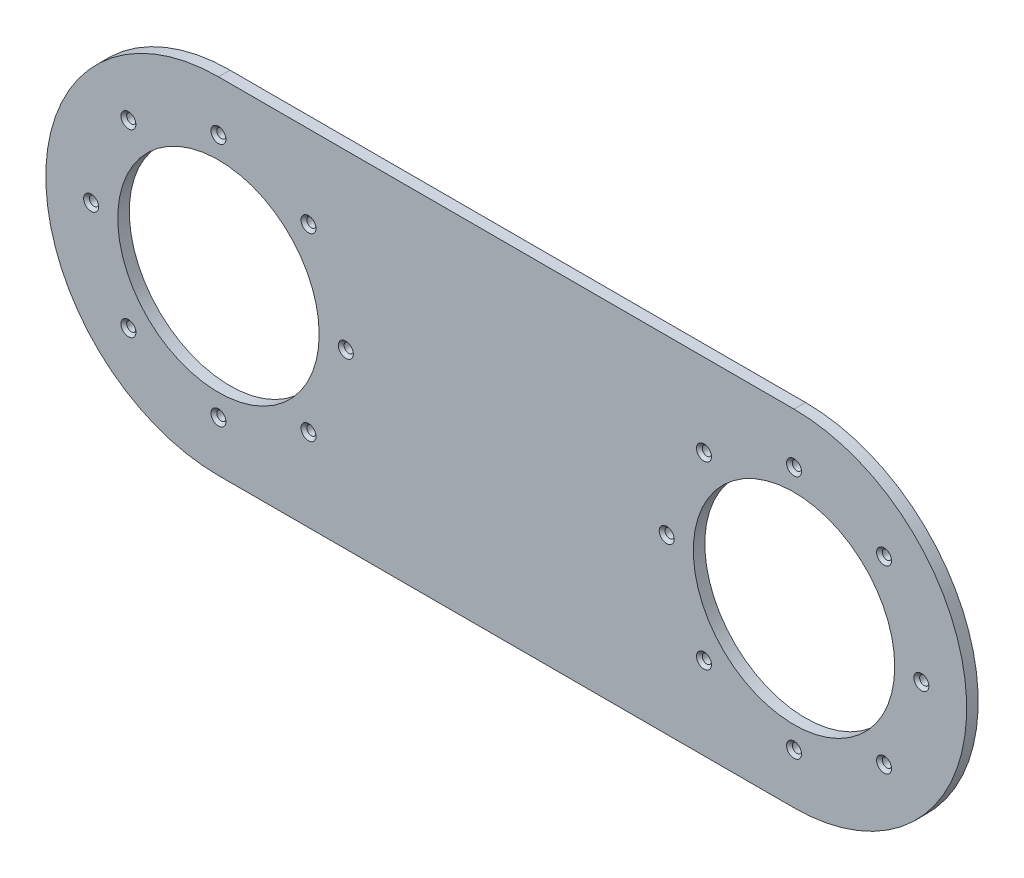
ISO-10303-21;
HEADER;
FILE_DESCRIPTION(('STEP AP214'),'2;1');
FILE_NAME('part.step','',(''),(''),'','','');
FILE_SCHEMA(('AUTOMOTIVE_DESIGN { 1 0 10303 214 1 1 1 1 }'));
ENDSEC;
DATA;
#1=APPLICATION_CONTEXT('core data for automotive mechanical design processes');
#2=APPLICATION_PROTOCOL_DEFINITION('international standard','automotive_design',2000,#1);
#3=PRODUCT_CONTEXT('',#1,'mechanical');
#4=PRODUCT('Part','Part','',(#3));
#5=PRODUCT_RELATED_PRODUCT_CATEGORY('part','',(#4));
#6=PRODUCT_DEFINITION_FORMATION('','',#4);
#7=PRODUCT_DEFINITION_CONTEXT('part definition',#1,'design');
#8=PRODUCT_DEFINITION('design','',#6,#7);
#9=PRODUCT_DEFINITION_SHAPE('','',#8);
#10=(LENGTH_UNIT() NAMED_UNIT(*) SI_UNIT(.MILLI.,.METRE.));
#11=(NAMED_UNIT(*) PLANE_ANGLE_UNIT() SI_UNIT($,.RADIAN.));
#12=(NAMED_UNIT(*) SI_UNIT($,.STERADIAN.) SOLID_ANGLE_UNIT());
#13=UNCERTAINTY_MEASURE_WITH_UNIT(LENGTH_MEASURE(1.E-05),#10,'distance_accuracy_value','');
#14=(GEOMETRIC_REPRESENTATION_CONTEXT(3) GLOBAL_UNCERTAINTY_ASSIGNED_CONTEXT((#13)) GLOBAL_UNIT_ASSIGNED_CONTEXT((#10,
#11,#12)) REPRESENTATION_CONTEXT('',''));
#15=CARTESIAN_POINT('',(0.,0.,0.));
#16=DIRECTION('',(0.,0.,1.));
#17=DIRECTION('',(1.,0.,0.));
#18=AXIS2_PLACEMENT_3D('',#15,#16,#17);
#19=CARTESIAN_POINT('',(0.,0.,4.));
#20=DIRECTION('',(0.,0.,1.));
#21=DIRECTION('',(1.,0.,0.));
#22=AXIS2_PLACEMENT_3D('',#19,#20,#21);
#23=PLANE('',#22);
#24=CARTESIAN_POINT('',(244.25,0.,4.));
#25=DIRECTION('',(0.,0.,1.));
#26=DIRECTION('',(1.,0.,0.));
#27=AXIS2_PLACEMENT_3D('',#24,#25,#26);
#28=CIRCLE('',#27,2.59999999999994);
#29=CARTESIAN_POINT('',(246.85,0.,4.));
#30=VERTEX_POINT('',#29);
#31=EDGE_CURVE('E261',#30,#30,#28,.F.);
#32=ORIENTED_EDGE('',*,*,#31,.T.);
#33=EDGE_LOOP('',(#32));
#34=FACE_BOUND('',#33,.T.);
#35=CARTESIAN_POINT('',(231.289475067505,31.2894750675047,4.));
#36=DIRECTION('',(0.,0.,1.));
#37=DIRECTION('',(1.,0.,0.));
#38=AXIS2_PLACEMENT_3D('',#35,#36,#37);
#39=CIRCLE('',#38,2.60000000000002);
#40=CARTESIAN_POINT('',(233.889475067505,31.2894750675047,4.));
#41=VERTEX_POINT('',#40);
#42=EDGE_CURVE('E257',#41,#41,#39,.F.);
#43=ORIENTED_EDGE('',*,*,#42,.T.);
#44=EDGE_LOOP('',(#43));
#45=FACE_BOUND('',#44,.T.);
#46=CARTESIAN_POINT('',(200.,42.5,4.));
#47=DIRECTION('',(0.,0.,1.));
#48=DIRECTION('',(1.,0.,0.));
#49=AXIS2_PLACEMENT_3D('',#46,#47,#48);
#50=CIRCLE('',#49,2.60000000000002);
#51=CARTESIAN_POINT('',(202.6,42.5,4.));
#52=VERTEX_POINT('',#51);
#53=EDGE_CURVE('E253',#52,#52,#50,.F.);
#54=ORIENTED_EDGE('',*,*,#53,.T.);
#55=EDGE_LOOP('',(#54));
#56=FACE_BOUND('',#55,.T.);
#57=CARTESIAN_POINT('',(231.289475067505,-31.2894750675047,4.));
#58=DIRECTION('',(0.,0.,1.));
#59=DIRECTION('',(1.,0.,0.));
#60=AXIS2_PLACEMENT_3D('',#57,#58,#59);
#61=CIRCLE('',#60,2.60000000000002);
#62=CARTESIAN_POINT('',(233.889475067505,-31.2894750675047,4.));
#63=VERTEX_POINT('',#62);
#64=EDGE_CURVE('E249',#63,#63,#61,.F.);
#65=ORIENTED_EDGE('',*,*,#64,.T.);
#66=EDGE_LOOP('',(#65));
#67=FACE_BOUND('',#66,.T.);
#68=CARTESIAN_POINT('',(200.,-42.5,4.));
#69=DIRECTION('',(0.,0.,1.));
#70=DIRECTION('',(1.,0.,0.));
#71=AXIS2_PLACEMENT_3D('',#68,#69,#70);
#72=CIRCLE('',#71,2.60000000000002);
#73=CARTESIAN_POINT('',(202.6,-42.5,4.));
#74=VERTEX_POINT('',#73);
#75=EDGE_CURVE('E245',#74,#74,#72,.F.);
#76=ORIENTED_EDGE('',*,*,#75,.T.);
#77=EDGE_LOOP('',(#76));
#78=FACE_BOUND('',#77,.T.);
#79=CARTESIAN_POINT('',(168.710524932495,31.2894750675047,4.));
#80=DIRECTION('',(0.,0.,1.));
#81=DIRECTION('',(1.,0.,0.));
#82=AXIS2_PLACEMENT_3D('',#79,#80,#81);
#83=CIRCLE('',#82,2.60000000000002);
#84=CARTESIAN_POINT('',(171.310524932495,31.2894750675047,4.));
#85=VERTEX_POINT('',#84);
#86=EDGE_CURVE('E241',#85,#85,#83,.F.);
#87=ORIENTED_EDGE('',*,*,#86,.T.);
#88=EDGE_LOOP('',(#87));
#89=FACE_BOUND('',#88,.T.);
#90=CARTESIAN_POINT('',(168.710524932495,-31.2894750675047,4.));
#91=DIRECTION('',(0.,0.,1.));
#92=DIRECTION('',(1.,0.,0.));
#93=AXIS2_PLACEMENT_3D('',#90,#91,#92);
#94=CIRCLE('',#93,2.60000000000002);
#95=CARTESIAN_POINT('',(171.310524932495,-31.2894750675047,4.));
#96=VERTEX_POINT('',#95);
#97=EDGE_CURVE('E237',#96,#96,#94,.F.);
#98=ORIENTED_EDGE('',*,*,#97,.T.);
#99=EDGE_LOOP('',(#98));
#100=FACE_BOUND('',#99,.T.);
#101=CARTESIAN_POINT('',(155.75,0.,4.));
#102=DIRECTION('',(0.,0.,1.));
#103=DIRECTION('',(1.,0.,0.));
#104=AXIS2_PLACEMENT_3D('',#101,#102,#103);
#105=CIRCLE('',#104,2.60000000000002);
#106=CARTESIAN_POINT('',(158.35,0.,4.));
#107=VERTEX_POINT('',#106);
#108=EDGE_CURVE('E233',#107,#107,#105,.F.);
#109=ORIENTED_EDGE('',*,*,#108,.T.);
#110=EDGE_LOOP('',(#109));
#111=FACE_BOUND('',#110,.T.);
#112=CARTESIAN_POINT('',(31.2894750675047,31.2894750675047,4.));
#113=DIRECTION('',(0.,0.,1.));
#114=DIRECTION('',(1.,0.,0.));
#115=AXIS2_PLACEMENT_3D('',#112,#113,#114);
#116=CIRCLE('',#115,2.60000000000005);
#117=CARTESIAN_POINT('',(33.8894750675048,31.2894750675047,4.));
#118=VERTEX_POINT('',#117);
#119=EDGE_CURVE('E229',#118,#118,#116,.F.);
#120=ORIENTED_EDGE('',*,*,#119,.T.);
#121=EDGE_LOOP('',(#120));
#122=FACE_BOUND('',#121,.T.);
#123=CARTESIAN_POINT('',(44.25,0.,4.));
#124=DIRECTION('',(0.,0.,1.));
#125=DIRECTION('',(1.,0.,0.));
#126=AXIS2_PLACEMENT_3D('',#123,#124,#125);
#127=CIRCLE('',#126,2.59999999999996);
#128=CARTESIAN_POINT('',(46.85,0.,4.));
#129=VERTEX_POINT('',#128);
#130=EDGE_CURVE('E225',#129,#129,#127,.F.);
#131=ORIENTED_EDGE('',*,*,#130,.T.);
#132=EDGE_LOOP('',(#131));
#133=FACE_BOUND('',#132,.T.);
#134=CARTESIAN_POINT('',(31.2894750675047,-31.2894750675047,4.));
#135=DIRECTION('',(0.,0.,1.));
#136=DIRECTION('',(1.,0.,0.));
#137=AXIS2_PLACEMENT_3D('',#134,#135,#136);
#138=CIRCLE('',#137,2.60000000000005);
#139=CARTESIAN_POINT('',(33.8894750675048,-31.2894750675047,4.));
#140=VERTEX_POINT('',#139);
#141=EDGE_CURVE('E221',#140,#140,#138,.F.);
#142=ORIENTED_EDGE('',*,*,#141,.T.);
#143=EDGE_LOOP('',(#142));
#144=FACE_BOUND('',#143,.T.);
#145=CARTESIAN_POINT('',(0.,-42.5,4.));
#146=DIRECTION('',(0.,0.,1.));
#147=DIRECTION('',(1.,0.,0.));
#148=AXIS2_PLACEMENT_3D('',#145,#146,#147);
#149=CIRCLE('',#148,2.60000000000005);
#150=CARTESIAN_POINT('',(2.60000000000005,-42.5,4.));
#151=VERTEX_POINT('',#150);
#152=EDGE_CURVE('E217',#151,#151,#149,.F.);
#153=ORIENTED_EDGE('',*,*,#152,.T.);
#154=EDGE_LOOP('',(#153));
#155=FACE_BOUND('',#154,.T.);
#156=CARTESIAN_POINT('',(-31.2894750675047,-31.2894750675047,4.));
#157=DIRECTION('',(0.,0.,1.));
#158=DIRECTION('',(1.,0.,0.));
#159=AXIS2_PLACEMENT_3D('',#156,#157,#158);
#160=CIRCLE('',#159,2.60000000000005);
#161=CARTESIAN_POINT('',(-28.6894750675047,-31.2894750675047,4.));
#162=VERTEX_POINT('',#161);
#163=EDGE_CURVE('E213',#162,#162,#160,.F.);
#164=ORIENTED_EDGE('',*,*,#163,.T.);
#165=EDGE_LOOP('',(#164));
#166=FACE_BOUND('',#165,.T.);
#167=CARTESIAN_POINT('',(0.,42.5,4.));
#168=DIRECTION('',(0.,0.,1.));
#169=DIRECTION('',(1.,0.,0.));
#170=AXIS2_PLACEMENT_3D('',#167,#168,#169);
#171=CIRCLE('',#170,2.60000000000005);
#172=CARTESIAN_POINT('',(2.60000000000005,42.5,4.));
#173=VERTEX_POINT('',#172);
#174=EDGE_CURVE('E209',#173,#173,#171,.F.);
#175=ORIENTED_EDGE('',*,*,#174,.T.);
#176=EDGE_LOOP('',(#175));
#177=FACE_BOUND('',#176,.T.);
#178=CARTESIAN_POINT('',(-44.25,0.,4.));
#179=DIRECTION('',(0.,0.,1.));
#180=DIRECTION('',(1.,0.,0.));
#181=AXIS2_PLACEMENT_3D('',#178,#179,#180);
#182=CIRCLE('',#181,2.59999999999996);
#183=CARTESIAN_POINT('',(-41.65,0.,4.));
#184=VERTEX_POINT('',#183);
#185=EDGE_CURVE('E205',#184,#184,#182,.F.);
#186=ORIENTED_EDGE('',*,*,#185,.T.);
#187=EDGE_LOOP('',(#186));
#188=FACE_BOUND('',#187,.T.);
#189=CARTESIAN_POINT('',(-31.2894750675047,31.2894750675047,4.));
#190=DIRECTION('',(0.,0.,1.));
#191=DIRECTION('',(1.,0.,0.));
#192=AXIS2_PLACEMENT_3D('',#189,#190,#191);
#193=CIRCLE('',#192,2.60000000000005);
#194=CARTESIAN_POINT('',(-28.6894750675047,31.2894750675047,4.));
#195=VERTEX_POINT('',#194);
#196=EDGE_CURVE('E136',#195,#195,#193,.F.);
#197=ORIENTED_EDGE('',*,*,#196,.T.);
#198=EDGE_LOOP('',(#197));
#199=FACE_BOUND('',#198,.T.);
#200=CARTESIAN_POINT('',(0.,0.,4.));
#201=DIRECTION('',(0.,0.,1.));
#202=DIRECTION('',(1.,0.,0.));
#203=AXIS2_PLACEMENT_3D('',#200,#201,#202);
#204=CIRCLE('',#203,35.);
#205=CARTESIAN_POINT('',(35.,0.,4.));
#206=VERTEX_POINT('',#205);
#207=EDGE_CURVE('E123',#206,#206,#204,.T.);
#208=ORIENTED_EDGE('',*,*,#207,.F.);
#209=EDGE_LOOP('',(#208));
#210=FACE_BOUND('',#209,.T.);
#211=CARTESIAN_POINT('',(0.,0.,4.));
#212=DIRECTION('',(0.,0.,1.));
#213=DIRECTION('',(1.,0.,0.));
#214=AXIS2_PLACEMENT_3D('',#211,#212,#213);
#215=CIRCLE('',#214,60.);
#216=CARTESIAN_POINT('',(0.,60.,4.));
#217=VERTEX_POINT('',#216);
#218=CARTESIAN_POINT('',(0.,-60.,4.));
#219=VERTEX_POINT('',#218);
#220=EDGE_CURVE('E100',#217,#219,#215,.T.);
#221=ORIENTED_EDGE('',*,*,#220,.T.);
#222=DIRECTION('',(1.,0.,0.));
#223=VECTOR('',#222,1.);
#224=CARTESIAN_POINT('',(0.,-60.,4.));
#225=LINE('',#224,#223);
#226=CARTESIAN_POINT('',(200.,-60.,4.));
#227=VERTEX_POINT('',#226);
#228=EDGE_CURVE('E95',#219,#227,#225,.T.);
#229=ORIENTED_EDGE('',*,*,#228,.T.);
#230=CARTESIAN_POINT('',(200.,0.,4.));
#231=DIRECTION('',(0.,0.,1.));
#232=DIRECTION('',(1.,0.,0.));
#233=AXIS2_PLACEMENT_3D('',#230,#231,#232);
#234=CIRCLE('',#233,60.);
#235=CARTESIAN_POINT('',(200.,60.,4.));
#236=VERTEX_POINT('',#235);
#237=EDGE_CURVE('E98',#227,#236,#234,.T.);
#238=ORIENTED_EDGE('',*,*,#237,.T.);
#239=DIRECTION('',(-1.,0.,0.));
#240=VECTOR('',#239,1.);
#241=CARTESIAN_POINT('',(0.,60.,4.));
#242=LINE('',#241,#240);
#243=EDGE_CURVE('E64',#236,#217,#242,.T.);
#244=ORIENTED_EDGE('',*,*,#243,.T.);
#245=EDGE_LOOP('',(#221,#229,#238,#244));
#246=FACE_BOUND('',#245,.T.);
#247=CARTESIAN_POINT('',(200.,0.,4.));
#248=DIRECTION('',(0.,0.,1.));
#249=DIRECTION('',(1.,0.,0.));
#250=AXIS2_PLACEMENT_3D('',#247,#248,#249);
#251=CIRCLE('',#250,35.);
#252=CARTESIAN_POINT('',(235.,0.,4.));
#253=VERTEX_POINT('',#252);
#254=EDGE_CURVE('E552',#253,#253,#251,.T.);
#255=ORIENTED_EDGE('',*,*,#254,.F.);
#256=EDGE_LOOP('',(#255));
#257=FACE_BOUND('',#256,.T.);
#258=ADVANCED_FACE('F45',(#34,#45,#56,#67,#78,#89,#100,#111,#122,#133,#144,#155,#166,#177,#188,
#199,#210,#246,#257),#23,.T.);
#259=CARTESIAN_POINT('',(0.,0.,0.));
#260=DIRECTION('',(0.,0.,1.));
#261=DIRECTION('',(1.,0.,0.));
#262=AXIS2_PLACEMENT_3D('',#259,#260,#261);
#263=PLANE('',#262);
#264=CARTESIAN_POINT('',(-44.25,0.,0.));
#265=DIRECTION('',(0.,0.,1.));
#266=DIRECTION('',(1.,0.,0.));
#267=AXIS2_PLACEMENT_3D('',#264,#265,#266);
#268=CIRCLE('',#267,1.6);
#269=CARTESIAN_POINT('',(-42.65,0.,0.));
#270=VERTEX_POINT('',#269);
#271=EDGE_CURVE('E197',#270,#270,#268,.T.);
#272=ORIENTED_EDGE('',*,*,#271,.T.);
#273=EDGE_LOOP('',(#272));
#274=FACE_BOUND('',#273,.T.);
#275=CARTESIAN_POINT('',(-31.2894750675047,-31.2894750675047,0.));
#276=DIRECTION('',(0.,0.,1.));
#277=DIRECTION('',(1.,0.,0.));
#278=AXIS2_PLACEMENT_3D('',#275,#276,#277);
#279=CIRCLE('',#278,1.59999999999999);
#280=CARTESIAN_POINT('',(-29.6894750675047,-31.2894750675047,0.));
#281=VERTEX_POINT('',#280);
#282=EDGE_CURVE('E193',#281,#281,#279,.T.);
#283=ORIENTED_EDGE('',*,*,#282,.T.);
#284=EDGE_LOOP('',(#283));
#285=FACE_BOUND('',#284,.T.);
#286=CARTESIAN_POINT('',(31.2894750675047,31.2894750675047,0.));
#287=DIRECTION('',(0.,0.,1.));
#288=DIRECTION('',(1.,0.,0.));
#289=AXIS2_PLACEMENT_3D('',#286,#287,#288);
#290=CIRCLE('',#289,1.6);
#291=CARTESIAN_POINT('',(32.8894750675047,31.2894750675047,0.));
#292=VERTEX_POINT('',#291);
#293=EDGE_CURVE('E189',#292,#292,#290,.T.);
#294=ORIENTED_EDGE('',*,*,#293,.T.);
#295=EDGE_LOOP('',(#294));
#296=FACE_BOUND('',#295,.T.);
#297=CARTESIAN_POINT('',(0.,42.5,0.));
#298=DIRECTION('',(0.,0.,1.));
#299=DIRECTION('',(1.,0.,0.));
#300=AXIS2_PLACEMENT_3D('',#297,#298,#299);
#301=CIRCLE('',#300,1.6);
#302=CARTESIAN_POINT('',(1.6,42.5,0.));
#303=VERTEX_POINT('',#302);
#304=EDGE_CURVE('E185',#303,#303,#301,.T.);
#305=ORIENTED_EDGE('',*,*,#304,.T.);
#306=EDGE_LOOP('',(#305));
#307=FACE_BOUND('',#306,.T.);
#308=CARTESIAN_POINT('',(0.,-42.5,0.));
#309=DIRECTION('',(0.,0.,1.));
#310=DIRECTION('',(1.,0.,0.));
#311=AXIS2_PLACEMENT_3D('',#308,#309,#310);
#312=CIRCLE('',#311,1.6);
#313=CARTESIAN_POINT('',(1.6,-42.5,0.));
#314=VERTEX_POINT('',#313);
#315=EDGE_CURVE('E149',#314,#314,#312,.T.);
#316=ORIENTED_EDGE('',*,*,#315,.T.);
#317=EDGE_LOOP('',(#316));
#318=FACE_BOUND('',#317,.T.);
#319=CARTESIAN_POINT('',(31.2894750675047,-31.2894750675047,0.));
#320=DIRECTION('',(0.,0.,1.));
#321=DIRECTION('',(1.,0.,0.));
#322=AXIS2_PLACEMENT_3D('',#319,#320,#321);
#323=CIRCLE('',#322,1.6);
#324=CARTESIAN_POINT('',(32.8894750675047,-31.2894750675047,0.));
#325=VERTEX_POINT('',#324);
#326=EDGE_CURVE('E145',#325,#325,#323,.T.);
#327=ORIENTED_EDGE('',*,*,#326,.T.);
#328=EDGE_LOOP('',(#327));
#329=FACE_BOUND('',#328,.T.);
#330=CARTESIAN_POINT('',(44.25,0.,0.));
#331=DIRECTION('',(0.,0.,1.));
#332=DIRECTION('',(1.,0.,0.));
#333=AXIS2_PLACEMENT_3D('',#330,#331,#332);
#334=CIRCLE('',#333,1.6);
#335=CARTESIAN_POINT('',(45.85,0.,0.));
#336=VERTEX_POINT('',#335);
#337=EDGE_CURVE('E141',#336,#336,#334,.T.);
#338=ORIENTED_EDGE('',*,*,#337,.T.);
#339=EDGE_LOOP('',(#338));
#340=FACE_BOUND('',#339,.T.);
#341=CARTESIAN_POINT('',(-31.2894750675047,31.2894750675047,0.));
#342=DIRECTION('',(0.,0.,1.));
#343=DIRECTION('',(1.,0.,0.));
#344=AXIS2_PLACEMENT_3D('',#341,#342,#343);
#345=CIRCLE('',#344,1.6);
#346=CARTESIAN_POINT('',(-29.6894750675047,31.2894750675047,0.));
#347=VERTEX_POINT('',#346);
#348=EDGE_CURVE('E137',#347,#347,#345,.T.);
#349=ORIENTED_EDGE('',*,*,#348,.T.);
#350=EDGE_LOOP('',(#349));
#351=FACE_BOUND('',#350,.T.);
#352=CARTESIAN_POINT('',(0.,0.,0.));
#353=DIRECTION('',(0.,0.,1.));
#354=DIRECTION('',(1.,0.,0.));
#355=AXIS2_PLACEMENT_3D('',#352,#353,#354);
#356=CIRCLE('',#355,60.);
#357=CARTESIAN_POINT('',(0.,60.,0.));
#358=VERTEX_POINT('',#357);
#359=CARTESIAN_POINT('',(0.,-60.,0.));
#360=VERTEX_POINT('',#359);
#361=EDGE_CURVE('E119',#358,#360,#356,.T.);
#362=ORIENTED_EDGE('',*,*,#361,.F.);
#363=DIRECTION('',(-1.,0.,0.));
#364=VECTOR('',#363,1.);
#365=CARTESIAN_POINT('',(0.,60.,0.));
#366=LINE('',#365,#364);
#367=CARTESIAN_POINT('',(200.,60.,0.));
#368=VERTEX_POINT('',#367);
#369=EDGE_CURVE('E87',#368,#358,#366,.T.);
#370=ORIENTED_EDGE('',*,*,#369,.F.);
#371=CARTESIAN_POINT('',(200.,0.,0.));
#372=DIRECTION('',(0.,0.,1.));
#373=DIRECTION('',(1.,0.,0.));
#374=AXIS2_PLACEMENT_3D('',#371,#372,#373);
#375=CIRCLE('',#374,60.);
#376=CARTESIAN_POINT('',(200.,-60.,0.));
#377=VERTEX_POINT('',#376);
#378=EDGE_CURVE('E81',#377,#368,#375,.T.);
#379=ORIENTED_EDGE('',*,*,#378,.F.);
#380=DIRECTION('',(1.,0.,0.));
#381=VECTOR('',#380,1.);
#382=CARTESIAN_POINT('',(0.,-60.,0.));
#383=LINE('',#382,#381);
#384=EDGE_CURVE('E106',#360,#377,#383,.T.);
#385=ORIENTED_EDGE('',*,*,#384,.F.);
#386=EDGE_LOOP('',(#362,#370,#379,#385));
#387=FACE_BOUND('',#386,.T.);
#388=CARTESIAN_POINT('',(0.,0.,0.));
#389=DIRECTION('',(0.,0.,1.));
#390=DIRECTION('',(1.,0.,0.));
#391=AXIS2_PLACEMENT_3D('',#388,#389,#390);
#392=CIRCLE('',#391,35.);
#393=CARTESIAN_POINT('',(35.,0.,0.));
#394=VERTEX_POINT('',#393);
#395=EDGE_CURVE('E493',#394,#394,#392,.T.);
#396=ORIENTED_EDGE('',*,*,#395,.T.);
#397=EDGE_LOOP('',(#396));
#398=FACE_BOUND('',#397,.T.);
#399=CARTESIAN_POINT('',(200.,0.,0.));
#400=DIRECTION('',(0.,0.,1.));
#401=DIRECTION('',(1.,0.,0.));
#402=AXIS2_PLACEMENT_3D('',#399,#400,#401);
#403=CIRCLE('',#402,35.);
#404=CARTESIAN_POINT('',(235.,0.,0.));
#405=VERTEX_POINT('',#404);
#406=EDGE_CURVE('E201',#405,#405,#403,.T.);
#407=ORIENTED_EDGE('',*,*,#406,.T.);
#408=EDGE_LOOP('',(#407));
#409=FACE_BOUND('',#408,.T.);
#410=CARTESIAN_POINT('',(200.,42.5,0.));
#411=DIRECTION('',(0.,0.,1.));
#412=DIRECTION('',(1.,0.,0.));
#413=AXIS2_PLACEMENT_3D('',#410,#411,#412);
#414=CIRCLE('',#413,1.60000000000002);
#415=CARTESIAN_POINT('',(201.6,42.5,0.));
#416=VERTEX_POINT('',#415);
#417=EDGE_CURVE('E153',#416,#416,#414,.F.);
#418=ORIENTED_EDGE('',*,*,#417,.F.);
#419=EDGE_LOOP('',(#418));
#420=FACE_BOUND('',#419,.T.);
#421=CARTESIAN_POINT('',(231.289475067505,31.2894750675047,0.));
#422=DIRECTION('',(0.,0.,1.));
#423=DIRECTION('',(1.,0.,0.));
#424=AXIS2_PLACEMENT_3D('',#421,#422,#423);
#425=CIRCLE('',#424,1.59999999999999);
#426=CARTESIAN_POINT('',(232.889475067505,31.2894750675047,0.));
#427=VERTEX_POINT('',#426);
#428=EDGE_CURVE('E157',#427,#427,#425,.F.);
#429=ORIENTED_EDGE('',*,*,#428,.F.);
#430=EDGE_LOOP('',(#429));
#431=FACE_BOUND('',#430,.T.);
#432=CARTESIAN_POINT('',(244.25,0.,0.));
#433=DIRECTION('',(0.,0.,1.));
#434=DIRECTION('',(1.,0.,0.));
#435=AXIS2_PLACEMENT_3D('',#432,#433,#434);
#436=CIRCLE('',#435,1.59999999999996);
#437=CARTESIAN_POINT('',(245.85,0.,0.));
#438=VERTEX_POINT('',#437);
#439=EDGE_CURVE('E161',#438,#438,#436,.F.);
#440=ORIENTED_EDGE('',*,*,#439,.F.);
#441=EDGE_LOOP('',(#440));
#442=FACE_BOUND('',#441,.T.);
#443=CARTESIAN_POINT('',(231.289475067505,-31.2894750675047,0.));
#444=DIRECTION('',(0.,0.,1.));
#445=DIRECTION('',(1.,0.,0.));
#446=AXIS2_PLACEMENT_3D('',#443,#444,#445);
#447=CIRCLE('',#446,1.59999999999996);
#448=CARTESIAN_POINT('',(232.889475067505,-31.2894750675047,0.));
#449=VERTEX_POINT('',#448);
#450=EDGE_CURVE('E165',#449,#449,#447,.F.);
#451=ORIENTED_EDGE('',*,*,#450,.F.);
#452=EDGE_LOOP('',(#451));
#453=FACE_BOUND('',#452,.T.);
#454=CARTESIAN_POINT('',(200.,-42.5,0.));
#455=DIRECTION('',(0.,0.,1.));
#456=DIRECTION('',(1.,0.,0.));
#457=AXIS2_PLACEMENT_3D('',#454,#455,#456);
#458=CIRCLE('',#457,1.60000000000002);
#459=CARTESIAN_POINT('',(201.6,-42.5,0.));
#460=VERTEX_POINT('',#459);
#461=EDGE_CURVE('E169',#460,#460,#458,.F.);
#462=ORIENTED_EDGE('',*,*,#461,.F.);
#463=EDGE_LOOP('',(#462));
#464=FACE_BOUND('',#463,.T.);
#465=CARTESIAN_POINT('',(168.710524932495,-31.2894750675047,0.));
#466=DIRECTION('',(0.,0.,1.));
#467=DIRECTION('',(1.,0.,0.));
#468=AXIS2_PLACEMENT_3D('',#465,#466,#467);
#469=CIRCLE('',#468,1.59999999999999);
#470=CARTESIAN_POINT('',(170.310524932495,-31.2894750675047,0.));
#471=VERTEX_POINT('',#470);
#472=EDGE_CURVE('E173',#471,#471,#469,.F.);
#473=ORIENTED_EDGE('',*,*,#472,.F.);
#474=EDGE_LOOP('',(#473));
#475=FACE_BOUND('',#474,.T.);
#476=CARTESIAN_POINT('',(155.75,0.,0.));
#477=DIRECTION('',(0.,0.,1.));
#478=DIRECTION('',(1.,0.,0.));
#479=AXIS2_PLACEMENT_3D('',#476,#477,#478);
#480=CIRCLE('',#479,1.59999999999999);
#481=CARTESIAN_POINT('',(157.35,0.,0.));
#482=VERTEX_POINT('',#481);
#483=EDGE_CURVE('E177',#482,#482,#480,.F.);
#484=ORIENTED_EDGE('',*,*,#483,.F.);
#485=EDGE_LOOP('',(#484));
#486=FACE_BOUND('',#485,.T.);
#487=CARTESIAN_POINT('',(168.710524932495,31.2894750675047,0.));
#488=DIRECTION('',(0.,0.,1.));
#489=DIRECTION('',(1.,0.,0.));
#490=AXIS2_PLACEMENT_3D('',#487,#488,#489);
#491=CIRCLE('',#490,1.59999999999999);
#492=CARTESIAN_POINT('',(170.310524932495,31.2894750675047,0.));
#493=VERTEX_POINT('',#492);
#494=EDGE_CURVE('E181',#493,#493,#491,.F.);
#495=ORIENTED_EDGE('',*,*,#494,.F.);
#496=EDGE_LOOP('',(#495));
#497=FACE_BOUND('',#496,.T.);
#498=ADVANCED_FACE('F342',(#274,#285,#296,#307,#318,#329,#340,#351,#387,#398,#409,#420,#431,
#442,#453,#464,#475,#486,#497),#263,.F.);
#499=CARTESIAN_POINT('',(0.,0.,4.));
#500=DIRECTION('',(0.,0.,-1.));
#501=DIRECTION('',(-1.,0.,0.));
#502=AXIS2_PLACEMENT_3D('',#499,#500,#501);
#503=CYLINDRICAL_SURFACE('',#502,60.);
#504=ORIENTED_EDGE('',*,*,#361,.T.);
#505=DIRECTION('',(0.,0.,-1.));
#506=VECTOR('',#505,1.);
#507=CARTESIAN_POINT('',(0.,-60.,4.));
#508=LINE('',#507,#506);
#509=EDGE_CURVE('E108',#219,#360,#508,.T.);
#510=ORIENTED_EDGE('',*,*,#509,.F.);
#511=ORIENTED_EDGE('',*,*,#220,.F.);
#512=DIRECTION('',(0.,0.,-1.));
#513=VECTOR('',#512,1.);
#514=CARTESIAN_POINT('',(0.,60.,4.));
#515=LINE('',#514,#513);
#516=EDGE_CURVE('E115',#217,#358,#515,.T.);
#517=ORIENTED_EDGE('',*,*,#516,.T.);
#518=EDGE_LOOP('',(#504,#510,#511,#517));
#519=FACE_BOUND('',#518,.T.);
#520=ADVANCED_FACE('F348',(#519),#503,.T.);
#521=CARTESIAN_POINT('',(0.,-60.,4.));
#522=DIRECTION('',(0.,1.,0.));
#523=DIRECTION('',(0.,0.,1.));
#524=AXIS2_PLACEMENT_3D('',#521,#522,#523);
#525=PLANE('',#524);
#526=ORIENTED_EDGE('',*,*,#384,.T.);
#527=DIRECTION('',(0.,0.,-1.));
#528=VECTOR('',#527,1.);
#529=CARTESIAN_POINT('',(200.,-60.,4.));
#530=LINE('',#529,#528);
#531=EDGE_CURVE('E104',#227,#377,#530,.T.);
#532=ORIENTED_EDGE('',*,*,#531,.F.);
#533=ORIENTED_EDGE('',*,*,#228,.F.);
#534=ORIENTED_EDGE('',*,*,#509,.T.);
#535=EDGE_LOOP('',(#526,#532,#533,#534));
#536=FACE_BOUND('',#535,.T.);
#537=ADVANCED_FACE('F105',(#536),#525,.F.);
#538=CARTESIAN_POINT('',(200.,0.,4.));
#539=DIRECTION('',(0.,0.,-1.));
#540=DIRECTION('',(-1.,0.,0.));
#541=AXIS2_PLACEMENT_3D('',#538,#539,#540);
#542=CYLINDRICAL_SURFACE('',#541,60.);
#543=ORIENTED_EDGE('',*,*,#378,.T.);
#544=DIRECTION('',(0.,0.,-1.));
#545=VECTOR('',#544,1.);
#546=CARTESIAN_POINT('',(200.,60.,4.));
#547=LINE('',#546,#545);
#548=EDGE_CURVE('E109',#236,#368,#547,.T.);
#549=ORIENTED_EDGE('',*,*,#548,.F.);
#550=ORIENTED_EDGE('',*,*,#237,.F.);
#551=ORIENTED_EDGE('',*,*,#531,.T.);
#552=EDGE_LOOP('',(#543,#549,#550,#551));
#553=FACE_BOUND('',#552,.T.);
#554=ADVANCED_FACE('F111',(#553),#542,.T.);
#555=CARTESIAN_POINT('',(0.,60.,4.));
#556=DIRECTION('',(0.,-1.,0.));
#557=DIRECTION('',(0.,0.,-1.));
#558=AXIS2_PLACEMENT_3D('',#555,#556,#557);
#559=PLANE('',#558);
#560=ORIENTED_EDGE('',*,*,#369,.T.);
#561=ORIENTED_EDGE('',*,*,#516,.F.);
#562=ORIENTED_EDGE('',*,*,#243,.F.);
#563=ORIENTED_EDGE('',*,*,#548,.T.);
#564=EDGE_LOOP('',(#560,#561,#562,#563));
#565=FACE_BOUND('',#564,.T.);
#566=ADVANCED_FACE('F356',(#565),#559,.F.);
#567=CARTESIAN_POINT('',(0.,0.,4.));
#568=DIRECTION('',(0.,0.,-1.));
#569=DIRECTION('',(-1.,0.,0.));
#570=AXIS2_PLACEMENT_3D('',#567,#568,#569);
#571=CYLINDRICAL_SURFACE('',#570,35.);
#572=ORIENTED_EDGE('',*,*,#207,.T.);
#573=EDGE_LOOP('',(#572));
#574=FACE_BOUND('',#573,.T.);
#575=ORIENTED_EDGE('',*,*,#395,.F.);
#576=EDGE_LOOP('',(#575));
#577=FACE_BOUND('',#576,.T.);
#578=ADVANCED_FACE('F353',(#574,#577),#571,.F.);
#579=CARTESIAN_POINT('',(200.,0.,4.));
#580=DIRECTION('',(0.,0.,-1.));
#581=DIRECTION('',(-1.,0.,0.));
#582=AXIS2_PLACEMENT_3D('',#579,#580,#581);
#583=CYLINDRICAL_SURFACE('',#582,35.);
#584=ORIENTED_EDGE('',*,*,#254,.T.);
#585=EDGE_LOOP('',(#584));
#586=FACE_BOUND('',#585,.T.);
#587=ORIENTED_EDGE('',*,*,#406,.F.);
#588=EDGE_LOOP('',(#587));
#589=FACE_BOUND('',#588,.T.);
#590=ADVANCED_FACE('F541',(#586,#589),#583,.F.);
#591=CARTESIAN_POINT('',(-31.2894750675047,31.2894750675047,-1.));
#592=DIRECTION('',(0.,0.,1.));
#593=DIRECTION('',(1.,0.,0.));
#594=AXIS2_PLACEMENT_3D('',#591,#592,#593);
#595=CYLINDRICAL_SURFACE('',#594,1.6);
#596=CARTESIAN_POINT('',(-31.2894750675047,31.2894750675047,2.99999999999998));
#597=DIRECTION('',(0.,0.,1.));
#598=DIRECTION('',(1.,0.,0.));
#599=AXIS2_PLACEMENT_3D('',#596,#597,#598);
#600=CIRCLE('',#599,1.6);
#601=CARTESIAN_POINT('',(-29.6894750675047,31.2894750675047,2.99999999999998));
#602=VERTEX_POINT('',#601);
#603=EDGE_CURVE('E11',#602,#602,#600,.T.);
#604=ORIENTED_EDGE('',*,*,#603,.T.);
#605=EDGE_LOOP('',(#604));
#606=FACE_BOUND('',#605,.T.);
#607=ORIENTED_EDGE('',*,*,#348,.F.);
#608=EDGE_LOOP('',(#607));
#609=FACE_BOUND('',#608,.T.);
#610=ADVANCED_FACE('F538',(#606,#609),#595,.F.);
#611=CARTESIAN_POINT('',(44.25,0.,-1.));
#612=DIRECTION('',(0.,0.,1.));
#613=DIRECTION('',(1.,0.,0.));
#614=AXIS2_PLACEMENT_3D('',#611,#612,#613);
#615=CYLINDRICAL_SURFACE('',#614,1.6);
#616=CARTESIAN_POINT('',(44.25,0.,3.00000000000003));
#617=DIRECTION('',(0.,0.,1.));
#618=DIRECTION('',(1.,0.,0.));
#619=AXIS2_PLACEMENT_3D('',#616,#617,#618);
#620=CIRCLE('',#619,1.6);
#621=CARTESIAN_POINT('',(45.85,0.,3.00000000000003));
#622=VERTEX_POINT('',#621);
#623=EDGE_CURVE('E301',#622,#622,#620,.T.);
#624=ORIENTED_EDGE('',*,*,#623,.T.);
#625=EDGE_LOOP('',(#624));
#626=FACE_BOUND('',#625,.T.);
#627=ORIENTED_EDGE('',*,*,#337,.F.);
#628=EDGE_LOOP('',(#627));
#629=FACE_BOUND('',#628,.T.);
#630=ADVANCED_FACE('F540',(#626,#629),#615,.F.);
#631=CARTESIAN_POINT('',(31.2894750675047,-31.2894750675047,-1.));
#632=DIRECTION('',(0.,0.,1.));
#633=DIRECTION('',(1.,0.,0.));
#634=AXIS2_PLACEMENT_3D('',#631,#632,#633);
#635=CYLINDRICAL_SURFACE('',#634,1.6);
#636=CARTESIAN_POINT('',(31.2894750675047,-31.2894750675047,2.99999999999997));
#637=DIRECTION('',(0.,0.,1.));
#638=DIRECTION('',(1.,0.,0.));
#639=AXIS2_PLACEMENT_3D('',#636,#637,#638);
#640=CIRCLE('',#639,1.6);
#641=CARTESIAN_POINT('',(32.8894750675047,-31.2894750675047,2.99999999999997));
#642=VERTEX_POINT('',#641);
#643=EDGE_CURVE('E305',#642,#642,#640,.T.);
#644=ORIENTED_EDGE('',*,*,#643,.T.);
#645=EDGE_LOOP('',(#644));
#646=FACE_BOUND('',#645,.T.);
#647=ORIENTED_EDGE('',*,*,#326,.F.);
#648=EDGE_LOOP('',(#647));
#649=FACE_BOUND('',#648,.T.);
#650=ADVANCED_FACE('F612',(#646,#649),#635,.F.);
#651=CARTESIAN_POINT('',(0.,-42.5,-1.));
#652=DIRECTION('',(0.,0.,1.));
#653=DIRECTION('',(1.,0.,0.));
#654=AXIS2_PLACEMENT_3D('',#651,#652,#653);
#655=CYLINDRICAL_SURFACE('',#654,1.6);
#656=CARTESIAN_POINT('',(0.,-42.5,2.99999999999997));
#657=DIRECTION('',(0.,0.,1.));
#658=DIRECTION('',(1.,0.,0.));
#659=AXIS2_PLACEMENT_3D('',#656,#657,#658);
#660=CIRCLE('',#659,1.6);
#661=CARTESIAN_POINT('',(1.6,-42.5,2.99999999999997));
#662=VERTEX_POINT('',#661);
#663=EDGE_CURVE('E309',#662,#662,#660,.T.);
#664=ORIENTED_EDGE('',*,*,#663,.T.);
#665=EDGE_LOOP('',(#664));
#666=FACE_BOUND('',#665,.T.);
#667=ORIENTED_EDGE('',*,*,#315,.F.);
#668=EDGE_LOOP('',(#667));
#669=FACE_BOUND('',#668,.T.);
#670=ADVANCED_FACE('F623',(#666,#669),#655,.F.);
#671=CARTESIAN_POINT('',(200.,42.5,-1.));
#672=DIRECTION('',(0.,0.,1.));
#673=DIRECTION('',(1.,0.,0.));
#674=AXIS2_PLACEMENT_3D('',#671,#672,#673);
#675=CYLINDRICAL_SURFACE('',#674,1.60000000000002);
#676=CARTESIAN_POINT('',(200.,42.5,2.99999999999999));
#677=DIRECTION('',(0.,0.,1.));
#678=DIRECTION('',(1.,0.,0.));
#679=AXIS2_PLACEMENT_3D('',#676,#677,#678);
#680=CIRCLE('',#679,1.60000000000002);
#681=CARTESIAN_POINT('',(201.6,42.5,2.99999999999999));
#682=VERTEX_POINT('',#681);
#683=EDGE_CURVE('E273',#682,#682,#680,.T.);
#684=ORIENTED_EDGE('',*,*,#683,.T.);
#685=EDGE_LOOP('',(#684));
#686=FACE_BOUND('',#685,.T.);
#687=ORIENTED_EDGE('',*,*,#417,.T.);
#688=EDGE_LOOP('',(#687));
#689=FACE_BOUND('',#688,.T.);
#690=ADVANCED_FACE('F634',(#686,#689),#675,.F.);
#691=CARTESIAN_POINT('',(231.289475067505,31.2894750675047,-1.));
#692=DIRECTION('',(0.,0.,1.));
#693=DIRECTION('',(1.,0.,0.));
#694=AXIS2_PLACEMENT_3D('',#691,#692,#693);
#695=CYLINDRICAL_SURFACE('',#694,1.59999999999999);
#696=CARTESIAN_POINT('',(231.289475067505,31.2894750675047,2.99999999999997));
#697=DIRECTION('',(0.,0.,1.));
#698=DIRECTION('',(1.,0.,0.));
#699=AXIS2_PLACEMENT_3D('',#696,#697,#698);
#700=CIRCLE('',#699,1.59999999999999);
#701=CARTESIAN_POINT('',(232.889475067505,31.2894750675047,2.99999999999997));
#702=VERTEX_POINT('',#701);
#703=EDGE_CURVE('E269',#702,#702,#700,.T.);
#704=ORIENTED_EDGE('',*,*,#703,.T.);
#705=EDGE_LOOP('',(#704));
#706=FACE_BOUND('',#705,.T.);
#707=ORIENTED_EDGE('',*,*,#428,.T.);
#708=EDGE_LOOP('',(#707));
#709=FACE_BOUND('',#708,.T.);
#710=ADVANCED_FACE('F645',(#706,#709),#695,.F.);
#711=CARTESIAN_POINT('',(244.25,0.,-1.));
#712=DIRECTION('',(0.,0.,1.));
#713=DIRECTION('',(1.,0.,0.));
#714=AXIS2_PLACEMENT_3D('',#711,#712,#713);
#715=CYLINDRICAL_SURFACE('',#714,1.59999999999996);
#716=CARTESIAN_POINT('',(244.25,0.,3.00000000000002));
#717=DIRECTION('',(0.,0.,1.));
#718=DIRECTION('',(1.,0.,0.));
#719=AXIS2_PLACEMENT_3D('',#716,#717,#718);
#720=CIRCLE('',#719,1.59999999999996);
#721=CARTESIAN_POINT('',(245.85,0.,3.00000000000002));
#722=VERTEX_POINT('',#721);
#723=EDGE_CURVE('E265',#722,#722,#720,.T.);
#724=ORIENTED_EDGE('',*,*,#723,.T.);
#725=EDGE_LOOP('',(#724));
#726=FACE_BOUND('',#725,.T.);
#727=ORIENTED_EDGE('',*,*,#439,.T.);
#728=EDGE_LOOP('',(#727));
#729=FACE_BOUND('',#728,.T.);
#730=ADVANCED_FACE('F656',(#726,#729),#715,.F.);
#731=CARTESIAN_POINT('',(231.289475067505,-31.2894750675047,-1.));
#732=DIRECTION('',(0.,0.,1.));
#733=DIRECTION('',(1.,0.,0.));
#734=AXIS2_PLACEMENT_3D('',#731,#732,#733);
#735=CYLINDRICAL_SURFACE('',#734,1.59999999999996);
#736=CARTESIAN_POINT('',(231.289475067505,-31.2894750675047,2.99999999999994));
#737=DIRECTION('',(0.,0.,1.));
#738=DIRECTION('',(1.,0.,0.));
#739=AXIS2_PLACEMENT_3D('',#736,#737,#738);
#740=CIRCLE('',#739,1.59999999999996);
#741=CARTESIAN_POINT('',(232.889475067505,-31.2894750675047,2.99999999999994));
#742=VERTEX_POINT('',#741);
#743=EDGE_CURVE('E277',#742,#742,#740,.T.);
#744=ORIENTED_EDGE('',*,*,#743,.T.);
#745=EDGE_LOOP('',(#744));
#746=FACE_BOUND('',#745,.T.);
#747=ORIENTED_EDGE('',*,*,#450,.T.);
#748=EDGE_LOOP('',(#747));
#749=FACE_BOUND('',#748,.T.);
#750=ADVANCED_FACE('F536',(#746,#749),#735,.F.);
#751=CARTESIAN_POINT('',(200.,-42.5,-1.));
#752=DIRECTION('',(0.,0.,1.));
#753=DIRECTION('',(1.,0.,0.));
#754=AXIS2_PLACEMENT_3D('',#751,#752,#753);
#755=CYLINDRICAL_SURFACE('',#754,1.60000000000002);
#756=CARTESIAN_POINT('',(200.,-42.5,2.99999999999999));
#757=DIRECTION('',(0.,0.,1.));
#758=DIRECTION('',(1.,0.,0.));
#759=AXIS2_PLACEMENT_3D('',#756,#757,#758);
#760=CIRCLE('',#759,1.60000000000002);
#761=CARTESIAN_POINT('',(201.6,-42.5,2.99999999999999));
#762=VERTEX_POINT('',#761);
#763=EDGE_CURVE('E281',#762,#762,#760,.T.);
#764=ORIENTED_EDGE('',*,*,#763,.T.);
#765=EDGE_LOOP('',(#764));
#766=FACE_BOUND('',#765,.T.);
#767=ORIENTED_EDGE('',*,*,#461,.T.);
#768=EDGE_LOOP('',(#767));
#769=FACE_BOUND('',#768,.T.);
#770=ADVANCED_FACE('F532',(#766,#769),#755,.F.);
#771=CARTESIAN_POINT('',(168.710524932495,-31.2894750675047,-1.));
#772=DIRECTION('',(0.,0.,1.));
#773=DIRECTION('',(1.,0.,0.));
#774=AXIS2_PLACEMENT_3D('',#771,#772,#773);
#775=CYLINDRICAL_SURFACE('',#774,1.59999999999999);
#776=CARTESIAN_POINT('',(168.710524932495,-31.2894750675047,2.99999999999997));
#777=DIRECTION('',(0.,0.,1.));
#778=DIRECTION('',(1.,0.,0.));
#779=AXIS2_PLACEMENT_3D('',#776,#777,#778);
#780=CIRCLE('',#779,1.59999999999999);
#781=CARTESIAN_POINT('',(170.310524932495,-31.2894750675047,2.99999999999997));
#782=VERTEX_POINT('',#781);
#783=EDGE_CURVE('E289',#782,#782,#780,.T.);
#784=ORIENTED_EDGE('',*,*,#783,.T.);
#785=EDGE_LOOP('',(#784));
#786=FACE_BOUND('',#785,.T.);
#787=ORIENTED_EDGE('',*,*,#472,.T.);
#788=EDGE_LOOP('',(#787));
#789=FACE_BOUND('',#788,.T.);
#790=ADVANCED_FACE('F525',(#786,#789),#775,.F.);
#791=CARTESIAN_POINT('',(155.75,0.,-1.));
#792=DIRECTION('',(0.,0.,1.));
#793=DIRECTION('',(1.,0.,0.));
#794=AXIS2_PLACEMENT_3D('',#791,#792,#793);
#795=CYLINDRICAL_SURFACE('',#794,1.59999999999999);
#796=CARTESIAN_POINT('',(155.75,0.,2.99999999999997));
#797=DIRECTION('',(0.,0.,1.));
#798=DIRECTION('',(1.,0.,0.));
#799=AXIS2_PLACEMENT_3D('',#796,#797,#798);
#800=CIRCLE('',#799,1.59999999999999);
#801=CARTESIAN_POINT('',(157.35,0.,2.99999999999997));
#802=VERTEX_POINT('',#801);
#803=EDGE_CURVE('E293',#802,#802,#800,.T.);
#804=ORIENTED_EDGE('',*,*,#803,.T.);
#805=EDGE_LOOP('',(#804));
#806=FACE_BOUND('',#805,.T.);
#807=ORIENTED_EDGE('',*,*,#483,.T.);
#808=EDGE_LOOP('',(#807));
#809=FACE_BOUND('',#808,.T.);
#810=ADVANCED_FACE('F516',(#806,#809),#795,.F.);
#811=CARTESIAN_POINT('',(168.710524932495,31.2894750675047,-1.));
#812=DIRECTION('',(0.,0.,1.));
#813=DIRECTION('',(1.,0.,0.));
#814=AXIS2_PLACEMENT_3D('',#811,#812,#813);
#815=CYLINDRICAL_SURFACE('',#814,1.59999999999999);
#816=CARTESIAN_POINT('',(168.710524932495,31.2894750675047,2.99999999999997));
#817=DIRECTION('',(0.,0.,1.));
#818=DIRECTION('',(1.,0.,0.));
#819=AXIS2_PLACEMENT_3D('',#816,#817,#818);
#820=CIRCLE('',#819,1.59999999999999);
#821=CARTESIAN_POINT('',(170.310524932495,31.2894750675047,2.99999999999997));
#822=VERTEX_POINT('',#821);
#823=EDGE_CURVE('E285',#822,#822,#820,.T.);
#824=ORIENTED_EDGE('',*,*,#823,.T.);
#825=EDGE_LOOP('',(#824));
#826=FACE_BOUND('',#825,.T.);
#827=ORIENTED_EDGE('',*,*,#494,.T.);
#828=EDGE_LOOP('',(#827));
#829=FACE_BOUND('',#828,.T.);
#830=ADVANCED_FACE('F513',(#826,#829),#815,.F.);
#831=CARTESIAN_POINT('',(0.,42.5,-1.));
#832=DIRECTION('',(0.,0.,1.));
#833=DIRECTION('',(1.,0.,0.));
#834=AXIS2_PLACEMENT_3D('',#831,#832,#833);
#835=CYLINDRICAL_SURFACE('',#834,1.6);
#836=CARTESIAN_POINT('',(0.,42.5,2.99999999999998));
#837=DIRECTION('',(0.,0.,1.));
#838=DIRECTION('',(1.,0.,0.));
#839=AXIS2_PLACEMENT_3D('',#836,#837,#838);
#840=CIRCLE('',#839,1.6);
#841=CARTESIAN_POINT('',(1.6,42.5,2.99999999999998));
#842=VERTEX_POINT('',#841);
#843=EDGE_CURVE('E317',#842,#842,#840,.T.);
#844=ORIENTED_EDGE('',*,*,#843,.T.);
#845=EDGE_LOOP('',(#844));
#846=FACE_BOUND('',#845,.T.);
#847=ORIENTED_EDGE('',*,*,#304,.F.);
#848=EDGE_LOOP('',(#847));
#849=FACE_BOUND('',#848,.T.);
#850=ADVANCED_FACE('F515',(#846,#849),#835,.F.);
#851=CARTESIAN_POINT('',(31.2894750675047,31.2894750675047,-1.));
#852=DIRECTION('',(0.,0.,1.));
#853=DIRECTION('',(1.,0.,0.));
#854=AXIS2_PLACEMENT_3D('',#851,#852,#853);
#855=CYLINDRICAL_SURFACE('',#854,1.6);
#856=CARTESIAN_POINT('',(31.2894750675047,31.2894750675047,2.99999999999997));
#857=DIRECTION('',(0.,0.,1.));
#858=DIRECTION('',(1.,0.,0.));
#859=AXIS2_PLACEMENT_3D('',#856,#857,#858);
#860=CIRCLE('',#859,1.6);
#861=CARTESIAN_POINT('',(32.8894750675047,31.2894750675047,2.99999999999997));
#862=VERTEX_POINT('',#861);
#863=EDGE_CURVE('E297',#862,#862,#860,.T.);
#864=ORIENTED_EDGE('',*,*,#863,.T.);
#865=EDGE_LOOP('',(#864));
#866=FACE_BOUND('',#865,.T.);
#867=ORIENTED_EDGE('',*,*,#293,.F.);
#868=EDGE_LOOP('',(#867));
#869=FACE_BOUND('',#868,.T.);
#870=ADVANCED_FACE('F471',(#866,#869),#855,.F.);
#871=CARTESIAN_POINT('',(-31.2894750675047,-31.2894750675047,-1.));
#872=DIRECTION('',(0.,0.,1.));
#873=DIRECTION('',(1.,0.,0.));
#874=AXIS2_PLACEMENT_3D('',#871,#872,#873);
#875=CYLINDRICAL_SURFACE('',#874,1.59999999999999);
#876=CARTESIAN_POINT('',(-31.2894750675047,-31.2894750675047,2.99999999999997));
#877=DIRECTION('',(0.,0.,1.));
#878=DIRECTION('',(1.,0.,0.));
#879=AXIS2_PLACEMENT_3D('',#876,#877,#878);
#880=CIRCLE('',#879,1.59999999999999);
#881=CARTESIAN_POINT('',(-29.6894750675047,-31.2894750675047,2.99999999999997));
#882=VERTEX_POINT('',#881);
#883=EDGE_CURVE('E313',#882,#882,#880,.T.);
#884=ORIENTED_EDGE('',*,*,#883,.T.);
#885=EDGE_LOOP('',(#884));
#886=FACE_BOUND('',#885,.T.);
#887=ORIENTED_EDGE('',*,*,#282,.F.);
#888=EDGE_LOOP('',(#887));
#889=FACE_BOUND('',#888,.T.);
#890=ADVANCED_FACE('F468',(#886,#889),#875,.F.);
#891=CARTESIAN_POINT('',(-44.25,0.,-1.));
#892=DIRECTION('',(0.,0.,1.));
#893=DIRECTION('',(1.,0.,0.));
#894=AXIS2_PLACEMENT_3D('',#891,#892,#893);
#895=CYLINDRICAL_SURFACE('',#894,1.6);
#896=CARTESIAN_POINT('',(-44.25,0.,3.00000000000003));
#897=DIRECTION('',(0.,0.,1.));
#898=DIRECTION('',(1.,0.,0.));
#899=AXIS2_PLACEMENT_3D('',#896,#897,#898);
#900=CIRCLE('',#899,1.6);
#901=CARTESIAN_POINT('',(-42.65,0.,3.00000000000003));
#902=VERTEX_POINT('',#901);
#903=EDGE_CURVE('E56',#902,#902,#900,.T.);
#904=ORIENTED_EDGE('',*,*,#903,.T.);
#905=EDGE_LOOP('',(#904));
#906=FACE_BOUND('',#905,.T.);
#907=ORIENTED_EDGE('',*,*,#271,.F.);
#908=EDGE_LOOP('',(#907));
#909=FACE_BOUND('',#908,.T.);
#910=ADVANCED_FACE('F324',(#906,#909),#895,.F.);
#911=CARTESIAN_POINT('',(244.25,0.,4.));
#912=DIRECTION('',(0.,0.,1.));
#913=DIRECTION('',(1.,0.,0.));
#914=AXIS2_PLACEMENT_3D('',#911,#912,#913);
#915=CONICAL_SURFACE('',#914,2.59999999999994,0.785398163397446);
#916=ORIENTED_EDGE('',*,*,#723,.F.);
#917=EDGE_LOOP('',(#916));
#918=FACE_BOUND('',#917,.T.);
#919=ORIENTED_EDGE('',*,*,#31,.F.);
#920=EDGE_LOOP('',(#919));
#921=FACE_BOUND('',#920,.T.);
#922=ADVANCED_FACE('F367',(#918,#921),#915,.F.);
#923=CARTESIAN_POINT('',(231.289475067505,31.2894750675047,4.));
#924=DIRECTION('',(0.,0.,1.));
#925=DIRECTION('',(1.,0.,0.));
#926=AXIS2_PLACEMENT_3D('',#923,#924,#925);
#927=CONICAL_SURFACE('',#926,2.60000000000002,0.785398163397445);
#928=ORIENTED_EDGE('',*,*,#703,.F.);
#929=EDGE_LOOP('',(#928));
#930=FACE_BOUND('',#929,.T.);
#931=ORIENTED_EDGE('',*,*,#42,.F.);
#932=EDGE_LOOP('',(#931));
#933=FACE_BOUND('',#932,.T.);
#934=ADVANCED_FACE('F373',(#930,#933),#927,.F.);
#935=CARTESIAN_POINT('',(200.,42.5,4.));
#936=DIRECTION('',(0.,0.,1.));
#937=DIRECTION('',(1.,0.,0.));
#938=AXIS2_PLACEMENT_3D('',#935,#936,#937);
#939=CONICAL_SURFACE('',#938,2.60000000000002,0.785398163397446);
#940=ORIENTED_EDGE('',*,*,#683,.F.);
#941=EDGE_LOOP('',(#940));
#942=FACE_BOUND('',#941,.T.);
#943=ORIENTED_EDGE('',*,*,#53,.F.);
#944=EDGE_LOOP('',(#943));
#945=FACE_BOUND('',#944,.T.);
#946=ADVANCED_FACE('F380',(#942,#945),#939,.F.);
#947=CARTESIAN_POINT('',(231.289475067505,-31.2894750675047,4.));
#948=DIRECTION('',(0.,0.,1.));
#949=DIRECTION('',(1.,0.,0.));
#950=AXIS2_PLACEMENT_3D('',#947,#948,#949);
#951=CONICAL_SURFACE('',#950,2.60000000000002,0.785398163397445);
#952=ORIENTED_EDGE('',*,*,#743,.F.);
#953=EDGE_LOOP('',(#952));
#954=FACE_BOUND('',#953,.T.);
#955=ORIENTED_EDGE('',*,*,#64,.F.);
#956=EDGE_LOOP('',(#955));
#957=FACE_BOUND('',#956,.T.);
#958=ADVANCED_FACE('F387',(#954,#957),#951,.F.);
#959=CARTESIAN_POINT('',(200.,-42.5,4.));
#960=DIRECTION('',(0.,0.,1.));
#961=DIRECTION('',(1.,0.,0.));
#962=AXIS2_PLACEMENT_3D('',#959,#960,#961);
#963=CONICAL_SURFACE('',#962,2.60000000000002,0.785398163397446);
#964=ORIENTED_EDGE('',*,*,#763,.F.);
#965=EDGE_LOOP('',(#964));
#966=FACE_BOUND('',#965,.T.);
#967=ORIENTED_EDGE('',*,*,#75,.F.);
#968=EDGE_LOOP('',(#967));
#969=FACE_BOUND('',#968,.T.);
#970=ADVANCED_FACE('F394',(#966,#969),#963,.F.);
#971=CARTESIAN_POINT('',(168.710524932495,31.2894750675047,4.));
#972=DIRECTION('',(0.,0.,1.));
#973=DIRECTION('',(1.,0.,0.));
#974=AXIS2_PLACEMENT_3D('',#971,#972,#973);
#975=CONICAL_SURFACE('',#974,2.60000000000002,0.785398163397445);
#976=ORIENTED_EDGE('',*,*,#823,.F.);
#977=EDGE_LOOP('',(#976));
#978=FACE_BOUND('',#977,.T.);
#979=ORIENTED_EDGE('',*,*,#86,.F.);
#980=EDGE_LOOP('',(#979));
#981=FACE_BOUND('',#980,.T.);
#982=ADVANCED_FACE('F401',(#978,#981),#975,.F.);
#983=CARTESIAN_POINT('',(168.710524932495,-31.2894750675047,4.));
#984=DIRECTION('',(0.,0.,1.));
#985=DIRECTION('',(1.,0.,0.));
#986=AXIS2_PLACEMENT_3D('',#983,#984,#985);
#987=CONICAL_SURFACE('',#986,2.60000000000002,0.785398163397445);
#988=ORIENTED_EDGE('',*,*,#783,.F.);
#989=EDGE_LOOP('',(#988));
#990=FACE_BOUND('',#989,.T.);
#991=ORIENTED_EDGE('',*,*,#97,.F.);
#992=EDGE_LOOP('',(#991));
#993=FACE_BOUND('',#992,.T.);
#994=ADVANCED_FACE('F408',(#990,#993),#987,.F.);
#995=CARTESIAN_POINT('',(155.75,0.,4.));
#996=DIRECTION('',(0.,0.,1.));
#997=DIRECTION('',(1.,0.,0.));
#998=AXIS2_PLACEMENT_3D('',#995,#996,#997);
#999=CONICAL_SURFACE('',#998,2.60000000000002,0.785398163397446);
#1000=ORIENTED_EDGE('',*,*,#803,.F.);
#1001=EDGE_LOOP('',(#1000));
#1002=FACE_BOUND('',#1001,.T.);
#1003=ORIENTED_EDGE('',*,*,#108,.F.);
#1004=EDGE_LOOP('',(#1003));
#1005=FACE_BOUND('',#1004,.T.);
#1006=ADVANCED_FACE('F415',(#1002,#1005),#999,.F.);
#1007=CARTESIAN_POINT('',(31.2894750675047,31.2894750675047,2.99999999999997));
#1008=DIRECTION('',(0.,0.,1.));
#1009=DIRECTION('',(1.,0.,0.));
#1010=AXIS2_PLACEMENT_3D('',#1007,#1008,#1009);
#1011=CONICAL_SURFACE('',#1010,1.6,0.785398163397459);
#1012=ORIENTED_EDGE('',*,*,#119,.F.);
#1013=EDGE_LOOP('',(#1012));
#1014=FACE_BOUND('',#1013,.T.);
#1015=ORIENTED_EDGE('',*,*,#863,.F.);
#1016=EDGE_LOOP('',(#1015));
#1017=FACE_BOUND('',#1016,.T.);
#1018=ADVANCED_FACE('F422',(#1014,#1017),#1011,.F.);
#1019=CARTESIAN_POINT('',(44.25,0.,3.00000000000003));
#1020=DIRECTION('',(0.,0.,1.));
#1021=DIRECTION('',(1.,0.,0.));
#1022=AXIS2_PLACEMENT_3D('',#1019,#1020,#1021);
#1023=CONICAL_SURFACE('',#1022,1.6,0.785398163397445);
#1024=ORIENTED_EDGE('',*,*,#130,.F.);
#1025=EDGE_LOOP('',(#1024));
#1026=FACE_BOUND('',#1025,.T.);
#1027=ORIENTED_EDGE('',*,*,#623,.F.);
#1028=EDGE_LOOP('',(#1027));
#1029=FACE_BOUND('',#1028,.T.);
#1030=ADVANCED_FACE('F429',(#1026,#1029),#1023,.F.);
#1031=CARTESIAN_POINT('',(31.2894750675047,-31.2894750675047,2.99999999999997));
#1032=DIRECTION('',(0.,0.,1.));
#1033=DIRECTION('',(1.,0.,0.));
#1034=AXIS2_PLACEMENT_3D('',#1031,#1032,#1033);
#1035=CONICAL_SURFACE('',#1034,1.6,0.785398163397459);
#1036=ORIENTED_EDGE('',*,*,#141,.F.);
#1037=EDGE_LOOP('',(#1036));
#1038=FACE_BOUND('',#1037,.T.);
#1039=ORIENTED_EDGE('',*,*,#643,.F.);
#1040=EDGE_LOOP('',(#1039));
#1041=FACE_BOUND('',#1040,.T.);
#1042=ADVANCED_FACE('F436',(#1038,#1041),#1035,.F.);
#1043=CARTESIAN_POINT('',(0.,-42.5,2.99999999999997));
#1044=DIRECTION('',(0.,0.,1.));
#1045=DIRECTION('',(1.,0.,0.));
#1046=AXIS2_PLACEMENT_3D('',#1043,#1044,#1045);
#1047=CONICAL_SURFACE('',#1046,1.6,0.785398163397459);
#1048=ORIENTED_EDGE('',*,*,#152,.F.);
#1049=EDGE_LOOP('',(#1048));
#1050=FACE_BOUND('',#1049,.T.);
#1051=ORIENTED_EDGE('',*,*,#663,.F.);
#1052=EDGE_LOOP('',(#1051));
#1053=FACE_BOUND('',#1052,.T.);
#1054=ADVANCED_FACE('F443',(#1050,#1053),#1047,.F.);
#1055=CARTESIAN_POINT('',(-31.2894750675047,-31.2894750675047,2.99999999999997));
#1056=DIRECTION('',(0.,0.,1.));
#1057=DIRECTION('',(1.,0.,0.));
#1058=AXIS2_PLACEMENT_3D('',#1055,#1056,#1057);
#1059=CONICAL_SURFACE('',#1058,1.59999999999999,0.785398163397459);
#1060=ORIENTED_EDGE('',*,*,#163,.F.);
#1061=EDGE_LOOP('',(#1060));
#1062=FACE_BOUND('',#1061,.T.);
#1063=ORIENTED_EDGE('',*,*,#883,.F.);
#1064=EDGE_LOOP('',(#1063));
#1065=FACE_BOUND('',#1064,.T.);
#1066=ADVANCED_FACE('F336',(#1062,#1065),#1059,.F.);
#1067=CARTESIAN_POINT('',(0.,42.5,2.99999999999998));
#1068=DIRECTION('',(0.,0.,1.));
#1069=DIRECTION('',(1.,0.,0.));
#1070=AXIS2_PLACEMENT_3D('',#1067,#1068,#1069);
#1071=CONICAL_SURFACE('',#1070,1.6,0.785398163397459);
#1072=ORIENTED_EDGE('',*,*,#174,.F.);
#1073=EDGE_LOOP('',(#1072));
#1074=FACE_BOUND('',#1073,.T.);
#1075=ORIENTED_EDGE('',*,*,#843,.F.);
#1076=EDGE_LOOP('',(#1075));
#1077=FACE_BOUND('',#1076,.T.);
#1078=ADVANCED_FACE('F329',(#1074,#1077),#1071,.F.);
#1079=CARTESIAN_POINT('',(-44.25,0.,3.00000000000003));
#1080=DIRECTION('',(0.,0.,1.));
#1081=DIRECTION('',(1.,0.,0.));
#1082=AXIS2_PLACEMENT_3D('',#1079,#1080,#1081);
#1083=CONICAL_SURFACE('',#1082,1.6,0.785398163397445);
#1084=ORIENTED_EDGE('',*,*,#185,.F.);
#1085=EDGE_LOOP('',(#1084));
#1086=FACE_BOUND('',#1085,.T.);
#1087=ORIENTED_EDGE('',*,*,#903,.F.);
#1088=EDGE_LOOP('',(#1087));
#1089=FACE_BOUND('',#1088,.T.);
#1090=ADVANCED_FACE('F327',(#1086,#1089),#1083,.F.);
#1091=CARTESIAN_POINT('',(-31.2894750675047,31.2894750675047,2.99999999999998));
#1092=DIRECTION('',(0.,0.,1.));
#1093=DIRECTION('',(1.,0.,0.));
#1094=AXIS2_PLACEMENT_3D('',#1091,#1092,#1093);
#1095=CONICAL_SURFACE('',#1094,1.6,0.78539816339746);
#1096=ORIENTED_EDGE('',*,*,#196,.F.);
#1097=EDGE_LOOP('',(#1096));
#1098=FACE_BOUND('',#1097,.T.);
#1099=ORIENTED_EDGE('',*,*,#603,.F.);
#1100=EDGE_LOOP('',(#1099));
#1101=FACE_BOUND('',#1100,.T.);
#1102=ADVANCED_FACE('F48',(#1098,#1101),#1095,.F.);
#1103=CLOSED_SHELL('',(#258,#498,#520,#537,#554,#566,#578,#590,#610,#630,#650,#670,#690,#710,
#730,#750,#770,#790,#810,#830,#850,#870,#890,#910,#922,#934,#946,#958,#970,#982,#994,#1006,
#1018,#1030,#1042,#1054,#1066,#1078,#1090,#1102));
#1104=MANIFOLD_SOLID_BREP('B2',#1103);
#1105=ADVANCED_BREP_SHAPE_REPRESENTATION('',(#18,#1104),#14);
#1106=SHAPE_DEFINITION_REPRESENTATION(#9,#1105);
ENDSEC;
END-ISO-10303-21;
